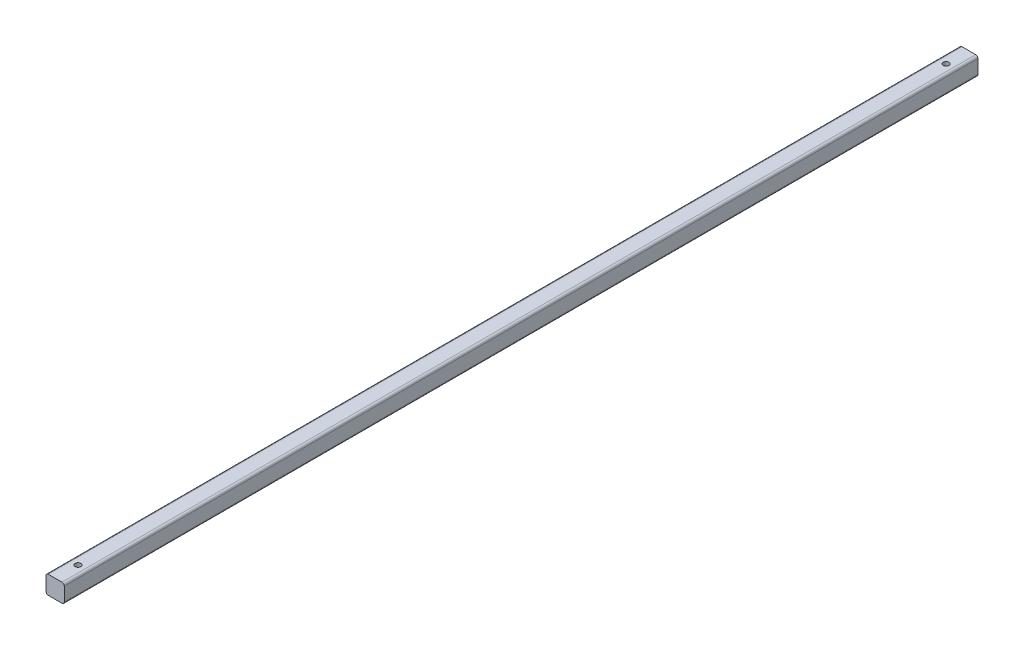
ISO-10303-21;
HEADER;
FILE_DESCRIPTION(('STEP AP214'),'2;1');
FILE_NAME('part.step','',(''),(''),'','','');
FILE_SCHEMA(('AUTOMOTIVE_DESIGN { 1 0 10303 214 1 1 1 1 }'));
ENDSEC;
DATA;
#1=APPLICATION_CONTEXT('core data for automotive mechanical design processes');
#2=APPLICATION_PROTOCOL_DEFINITION('international standard','automotive_design',2000,#1);
#3=PRODUCT_CONTEXT('',#1,'mechanical');
#4=PRODUCT('Part','Part','',(#3));
#5=PRODUCT_RELATED_PRODUCT_CATEGORY('part','',(#4));
#6=PRODUCT_DEFINITION_FORMATION('','',#4);
#7=PRODUCT_DEFINITION_CONTEXT('part definition',#1,'design');
#8=PRODUCT_DEFINITION('design','',#6,#7);
#9=PRODUCT_DEFINITION_SHAPE('','',#8);
#10=(LENGTH_UNIT() NAMED_UNIT(*) SI_UNIT(.MILLI.,.METRE.));
#11=(NAMED_UNIT(*) PLANE_ANGLE_UNIT() SI_UNIT($,.RADIAN.));
#12=(NAMED_UNIT(*) SI_UNIT($,.STERADIAN.) SOLID_ANGLE_UNIT());
#13=UNCERTAINTY_MEASURE_WITH_UNIT(LENGTH_MEASURE(1.E-05),#10,'distance_accuracy_value','');
#14=(GEOMETRIC_REPRESENTATION_CONTEXT(3) GLOBAL_UNCERTAINTY_ASSIGNED_CONTEXT((#13)) GLOBAL_UNIT_ASSIGNED_CONTEXT((#10,
#11,#12)) REPRESENTATION_CONTEXT('',''));
#15=CARTESIAN_POINT('',(0.,0.,0.));
#16=DIRECTION('',(0.,0.,1.));
#17=DIRECTION('',(1.,0.,0.));
#18=AXIS2_PLACEMENT_3D('',#15,#16,#17);
#19=CARTESIAN_POINT('',(-1.99999999999997,-2.,100.));
#20=DIRECTION('',(1.,0.,0.));
#21=DIRECTION('',(0.,0.,-1.));
#22=AXIS2_PLACEMENT_3D('',#19,#20,#21);
#23=PLANE('',#22);
#24=DIRECTION('',(0.,-1.,0.));
#25=VECTOR('',#24,1.);
#26=CARTESIAN_POINT('',(-1.99999999999997,-2.,-100.));
#27=LINE('',#26,#25);
#28=CARTESIAN_POINT('',(-1.99999999999997,1.5,-100.));
#29=VERTEX_POINT('',#28);
#30=CARTESIAN_POINT('',(-1.99999999999997,-1.5,-100.));
#31=VERTEX_POINT('',#30);
#32=EDGE_CURVE('E185',#29,#31,#27,.T.);
#33=ORIENTED_EDGE('',*,*,#32,.T.);
#34=DIRECTION('',(0.,0.,-1.));
#35=VECTOR('',#34,1.);
#36=CARTESIAN_POINT('',(-1.99999999999997,-1.5,100.));
#37=LINE('',#36,#35);
#38=CARTESIAN_POINT('',(-1.99999999999997,-1.5,100.));
#39=VERTEX_POINT('',#38);
#40=EDGE_CURVE('E11',#31,#39,#37,.F.);
#41=ORIENTED_EDGE('',*,*,#40,.T.);
#42=DIRECTION('',(0.,-1.,0.));
#43=VECTOR('',#42,1.);
#44=CARTESIAN_POINT('',(-1.99999999999997,-2.,100.));
#45=LINE('',#44,#43);
#46=CARTESIAN_POINT('',(-1.99999999999997,1.5,100.));
#47=VERTEX_POINT('',#46);
#48=EDGE_CURVE('E138',#47,#39,#45,.T.);
#49=ORIENTED_EDGE('',*,*,#48,.F.);
#50=DIRECTION('',(0.,0.,-1.));
#51=VECTOR('',#50,1.);
#52=CARTESIAN_POINT('',(-1.99999999999997,1.5,100.));
#53=LINE('',#52,#51);
#54=EDGE_CURVE('E51',#47,#29,#53,.T.);
#55=ORIENTED_EDGE('',*,*,#54,.T.);
#56=EDGE_LOOP('',(#33,#41,#49,#55));
#57=FACE_BOUND('',#56,.T.);
#58=ADVANCED_FACE('F42',(#57),#23,.F.);
#59=CARTESIAN_POINT('',(1.99999999999997,-2.,100.));
#60=DIRECTION('',(0.,1.,0.));
#61=DIRECTION('',(0.,0.,1.));
#62=AXIS2_PLACEMENT_3D('',#59,#60,#61);
#63=PLANE('',#62);
#64=CARTESIAN_POINT('',(0.,-2.,-95.));
#65=DIRECTION('',(0.,1.,0.));
#66=DIRECTION('',(0.,0.,1.));
#67=AXIS2_PLACEMENT_3D('',#64,#65,#66);
#68=CIRCLE('',#67,0.624999999999998);
#69=CARTESIAN_POINT('',(0.,-2.,-94.375));
#70=VERTEX_POINT('',#69);
#71=EDGE_CURVE('E210',#70,#70,#68,.T.);
#72=ORIENTED_EDGE('',*,*,#71,.T.);
#73=EDGE_LOOP('',(#72));
#74=FACE_BOUND('',#73,.T.);
#75=CARTESIAN_POINT('',(0.,-2.,95.));
#76=DIRECTION('',(0.,1.,0.));
#77=DIRECTION('',(0.,0.,1.));
#78=AXIS2_PLACEMENT_3D('',#75,#76,#77);
#79=CIRCLE('',#78,0.624999999999998);
#80=CARTESIAN_POINT('',(0.,-2.,95.625));
#81=VERTEX_POINT('',#80);
#82=EDGE_CURVE('E191',#81,#81,#79,.T.);
#83=ORIENTED_EDGE('',*,*,#82,.T.);
#84=EDGE_LOOP('',(#83));
#85=FACE_BOUND('',#84,.T.);
#86=DIRECTION('',(1.,0.,0.));
#87=VECTOR('',#86,1.);
#88=CARTESIAN_POINT('',(1.99999999999997,-2.,-100.));
#89=LINE('',#88,#87);
#90=CARTESIAN_POINT('',(-1.49999999999997,-2.,-100.));
#91=VERTEX_POINT('',#90);
#92=CARTESIAN_POINT('',(1.49999999999997,-2.,-100.));
#93=VERTEX_POINT('',#92);
#94=EDGE_CURVE('E145',#91,#93,#89,.T.);
#95=ORIENTED_EDGE('',*,*,#94,.T.);
#96=DIRECTION('',(0.,0.,-1.));
#97=VECTOR('',#96,1.);
#98=CARTESIAN_POINT('',(1.49999999999997,-2.,100.));
#99=LINE('',#98,#97);
#100=CARTESIAN_POINT('',(1.49999999999997,-2.,100.));
#101=VERTEX_POINT('',#100);
#102=EDGE_CURVE('E58',#93,#101,#99,.F.);
#103=ORIENTED_EDGE('',*,*,#102,.T.);
#104=DIRECTION('',(1.,0.,0.));
#105=VECTOR('',#104,1.);
#106=CARTESIAN_POINT('',(1.99999999999997,-2.,100.));
#107=LINE('',#106,#105);
#108=CARTESIAN_POINT('',(-1.49999999999997,-2.,100.));
#109=VERTEX_POINT('',#108);
#110=EDGE_CURVE('E143',#109,#101,#107,.T.);
#111=ORIENTED_EDGE('',*,*,#110,.F.);
#112=DIRECTION('',(0.,0.,-1.));
#113=VECTOR('',#112,1.);
#114=CARTESIAN_POINT('',(-1.49999999999997,-2.,100.));
#115=LINE('',#114,#113);
#116=EDGE_CURVE('E174',#109,#91,#115,.T.);
#117=ORIENTED_EDGE('',*,*,#116,.T.);
#118=EDGE_LOOP('',(#95,#103,#111,#117));
#119=FACE_BOUND('',#118,.T.);
#120=ADVANCED_FACE('F242',(#74,#85,#119),#63,.F.);
#121=CARTESIAN_POINT('',(1.99999999999997,-2.,100.));
#122=DIRECTION('',(-1.,0.,0.));
#123=DIRECTION('',(0.,0.,1.));
#124=AXIS2_PLACEMENT_3D('',#121,#122,#123);
#125=PLANE('',#124);
#126=DIRECTION('',(0.,1.,0.));
#127=VECTOR('',#126,1.);
#128=CARTESIAN_POINT('',(1.99999999999997,-2.,-100.));
#129=LINE('',#128,#127);
#130=CARTESIAN_POINT('',(1.99999999999997,-1.5,-100.));
#131=VERTEX_POINT('',#130);
#132=CARTESIAN_POINT('',(1.99999999999997,1.5,-100.));
#133=VERTEX_POINT('',#132);
#134=EDGE_CURVE('E139',#131,#133,#129,.T.);
#135=ORIENTED_EDGE('',*,*,#134,.T.);
#136=DIRECTION('',(0.,0.,-1.));
#137=VECTOR('',#136,1.);
#138=CARTESIAN_POINT('',(1.99999999999997,1.5,100.));
#139=LINE('',#138,#137);
#140=CARTESIAN_POINT('',(1.99999999999997,1.5,100.));
#141=VERTEX_POINT('',#140);
#142=EDGE_CURVE('E114',#133,#141,#139,.F.);
#143=ORIENTED_EDGE('',*,*,#142,.T.);
#144=DIRECTION('',(0.,1.,0.));
#145=VECTOR('',#144,1.);
#146=CARTESIAN_POINT('',(1.99999999999997,-2.,100.));
#147=LINE('',#146,#145);
#148=CARTESIAN_POINT('',(1.99999999999997,-1.5,100.));
#149=VERTEX_POINT('',#148);
#150=EDGE_CURVE('E201',#149,#141,#147,.T.);
#151=ORIENTED_EDGE('',*,*,#150,.F.);
#152=DIRECTION('',(0.,0.,-1.));
#153=VECTOR('',#152,1.);
#154=CARTESIAN_POINT('',(1.99999999999997,-1.5,100.));
#155=LINE('',#154,#153);
#156=EDGE_CURVE('E120',#149,#131,#155,.T.);
#157=ORIENTED_EDGE('',*,*,#156,.T.);
#158=EDGE_LOOP('',(#135,#143,#151,#157));
#159=FACE_BOUND('',#158,.T.);
#160=ADVANCED_FACE('F224',(#159),#125,.F.);
#161=CARTESIAN_POINT('',(1.99999999999997,2.,100.));
#162=DIRECTION('',(0.,-1.,0.));
#163=DIRECTION('',(0.,0.,-1.));
#164=AXIS2_PLACEMENT_3D('',#161,#162,#163);
#165=PLANE('',#164);
#166=CARTESIAN_POINT('',(0.,2.,-95.));
#167=DIRECTION('',(0.,1.,0.));
#168=DIRECTION('',(0.,0.,1.));
#169=AXIS2_PLACEMENT_3D('',#166,#167,#168);
#170=CIRCLE('',#169,0.624999999999999);
#171=CARTESIAN_POINT('',(0.,2.,-94.375));
#172=VERTEX_POINT('',#171);
#173=EDGE_CURVE('E214',#172,#172,#170,.T.);
#174=ORIENTED_EDGE('',*,*,#173,.F.);
#175=EDGE_LOOP('',(#174));
#176=FACE_BOUND('',#175,.T.);
#177=CARTESIAN_POINT('',(0.,2.,95.));
#178=DIRECTION('',(0.,1.,0.));
#179=DIRECTION('',(0.,0.,1.));
#180=AXIS2_PLACEMENT_3D('',#177,#178,#179);
#181=CIRCLE('',#180,0.624999999999999);
#182=CARTESIAN_POINT('',(0.,2.,95.625));
#183=VERTEX_POINT('',#182);
#184=EDGE_CURVE('E196',#183,#183,#181,.T.);
#185=ORIENTED_EDGE('',*,*,#184,.F.);
#186=EDGE_LOOP('',(#185));
#187=FACE_BOUND('',#186,.T.);
#188=DIRECTION('',(-1.,0.,0.));
#189=VECTOR('',#188,1.);
#190=CARTESIAN_POINT('',(1.99999999999997,2.,100.));
#191=LINE('',#190,#189);
#192=CARTESIAN_POINT('',(1.49999999999997,2.,100.));
#193=VERTEX_POINT('',#192);
#194=CARTESIAN_POINT('',(-1.49999999999997,2.,100.));
#195=VERTEX_POINT('',#194);
#196=EDGE_CURVE('E130',#193,#195,#191,.T.);
#197=ORIENTED_EDGE('',*,*,#196,.F.);
#198=DIRECTION('',(0.,0.,-1.));
#199=VECTOR('',#198,1.);
#200=CARTESIAN_POINT('',(1.49999999999997,2.,100.));
#201=LINE('',#200,#199);
#202=CARTESIAN_POINT('',(1.49999999999997,2.,-100.));
#203=VERTEX_POINT('',#202);
#204=EDGE_CURVE('E113',#193,#203,#201,.T.);
#205=ORIENTED_EDGE('',*,*,#204,.T.);
#206=DIRECTION('',(-1.,0.,0.));
#207=VECTOR('',#206,1.);
#208=CARTESIAN_POINT('',(1.99999999999997,2.,-100.));
#209=LINE('',#208,#207);
#210=CARTESIAN_POINT('',(-1.49999999999997,2.,-100.));
#211=VERTEX_POINT('',#210);
#212=EDGE_CURVE('E127',#203,#211,#209,.T.);
#213=ORIENTED_EDGE('',*,*,#212,.T.);
#214=DIRECTION('',(0.,0.,-1.));
#215=VECTOR('',#214,1.);
#216=CARTESIAN_POINT('',(-1.49999999999997,2.,100.));
#217=LINE('',#216,#215);
#218=EDGE_CURVE('E133',#211,#195,#217,.F.);
#219=ORIENTED_EDGE('',*,*,#218,.T.);
#220=EDGE_LOOP('',(#197,#205,#213,#219));
#221=FACE_BOUND('',#220,.T.);
#222=ADVANCED_FACE('F126',(#176,#187,#221),#165,.F.);
#223=CARTESIAN_POINT('',(0.,0.,100.));
#224=DIRECTION('',(0.,0.,1.));
#225=DIRECTION('',(1.,0.,0.));
#226=AXIS2_PLACEMENT_3D('',#223,#224,#225);
#227=PLANE('',#226);
#228=ORIENTED_EDGE('',*,*,#150,.T.);
#229=CARTESIAN_POINT('',(1.49999999999997,1.5,100.));
#230=DIRECTION('',(0.,0.,1.));
#231=DIRECTION('',(1.,0.,0.));
#232=AXIS2_PLACEMENT_3D('',#229,#230,#231);
#233=CIRCLE('',#232,0.5);
#234=EDGE_CURVE('E171',#141,#193,#233,.T.);
#235=ORIENTED_EDGE('',*,*,#234,.T.);
#236=ORIENTED_EDGE('',*,*,#196,.T.);
#237=CARTESIAN_POINT('',(-1.49999999999997,1.5,100.));
#238=DIRECTION('',(0.,0.,1.));
#239=DIRECTION('',(1.,0.,0.));
#240=AXIS2_PLACEMENT_3D('',#237,#238,#239);
#241=CIRCLE('',#240,0.5);
#242=EDGE_CURVE('E163',#195,#47,#241,.T.);
#243=ORIENTED_EDGE('',*,*,#242,.T.);
#244=ORIENTED_EDGE('',*,*,#48,.T.);
#245=CARTESIAN_POINT('',(-1.49999999999997,-1.5,100.));
#246=DIRECTION('',(0.,0.,1.));
#247=DIRECTION('',(1.,0.,0.));
#248=AXIS2_PLACEMENT_3D('',#245,#246,#247);
#249=CIRCLE('',#248,0.5);
#250=EDGE_CURVE('E65',#39,#109,#249,.T.);
#251=ORIENTED_EDGE('',*,*,#250,.T.);
#252=ORIENTED_EDGE('',*,*,#110,.T.);
#253=CARTESIAN_POINT('',(1.49999999999997,-1.5,100.));
#254=DIRECTION('',(0.,0.,1.));
#255=DIRECTION('',(1.,0.,0.));
#256=AXIS2_PLACEMENT_3D('',#253,#254,#255);
#257=CIRCLE('',#256,0.5);
#258=EDGE_CURVE('E168',#101,#149,#257,.T.);
#259=ORIENTED_EDGE('',*,*,#258,.T.);
#260=EDGE_LOOP('',(#228,#235,#236,#243,#244,#251,#252,#259));
#261=FACE_BOUND('',#260,.T.);
#262=ADVANCED_FACE('F223',(#261),#227,.T.);
#263=CARTESIAN_POINT('',(0.,0.,-100.));
#264=DIRECTION('',(0.,0.,1.));
#265=DIRECTION('',(1.,0.,0.));
#266=AXIS2_PLACEMENT_3D('',#263,#264,#265);
#267=PLANE('',#266);
#268=ORIENTED_EDGE('',*,*,#212,.F.);
#269=CARTESIAN_POINT('',(1.49999999999997,1.5,-100.));
#270=DIRECTION('',(0.,0.,1.));
#271=DIRECTION('',(1.,0.,0.));
#272=AXIS2_PLACEMENT_3D('',#269,#270,#271);
#273=CIRCLE('',#272,0.5);
#274=EDGE_CURVE('E109',#203,#133,#273,.F.);
#275=ORIENTED_EDGE('',*,*,#274,.T.);
#276=ORIENTED_EDGE('',*,*,#134,.F.);
#277=CARTESIAN_POINT('',(1.49999999999997,-1.5,-100.));
#278=DIRECTION('',(0.,0.,1.));
#279=DIRECTION('',(1.,0.,0.));
#280=AXIS2_PLACEMENT_3D('',#277,#278,#279);
#281=CIRCLE('',#280,0.5);
#282=EDGE_CURVE('E121',#131,#93,#281,.F.);
#283=ORIENTED_EDGE('',*,*,#282,.T.);
#284=ORIENTED_EDGE('',*,*,#94,.F.);
#285=CARTESIAN_POINT('',(-1.49999999999997,-1.5,-100.));
#286=DIRECTION('',(0.,0.,1.));
#287=DIRECTION('',(1.,0.,0.));
#288=AXIS2_PLACEMENT_3D('',#285,#286,#287);
#289=CIRCLE('',#288,0.5);
#290=EDGE_CURVE('E153',#91,#31,#289,.F.);
#291=ORIENTED_EDGE('',*,*,#290,.T.);
#292=ORIENTED_EDGE('',*,*,#32,.F.);
#293=CARTESIAN_POINT('',(-1.49999999999997,1.5,-100.));
#294=DIRECTION('',(0.,0.,1.));
#295=DIRECTION('',(1.,0.,0.));
#296=AXIS2_PLACEMENT_3D('',#293,#294,#295);
#297=CIRCLE('',#296,0.5);
#298=EDGE_CURVE('E132',#29,#211,#297,.F.);
#299=ORIENTED_EDGE('',*,*,#298,.T.);
#300=EDGE_LOOP('',(#268,#275,#276,#283,#284,#291,#292,#299));
#301=FACE_BOUND('',#300,.T.);
#302=ADVANCED_FACE('F135',(#301),#267,.F.);
#303=CARTESIAN_POINT('',(1.49999999999997,1.5,100.));
#304=DIRECTION('',(0.,0.,-1.));
#305=DIRECTION('',(-1.,0.,0.));
#306=AXIS2_PLACEMENT_3D('',#303,#304,#305);
#307=CYLINDRICAL_SURFACE('',#306,0.5);
#308=ORIENTED_EDGE('',*,*,#234,.F.);
#309=ORIENTED_EDGE('',*,*,#142,.F.);
#310=ORIENTED_EDGE('',*,*,#274,.F.);
#311=ORIENTED_EDGE('',*,*,#204,.F.);
#312=EDGE_LOOP('',(#308,#309,#310,#311));
#313=FACE_BOUND('',#312,.T.);
#314=ADVANCED_FACE('F112',(#313),#307,.T.);
#315=CARTESIAN_POINT('',(1.49999999999997,-1.5,100.));
#316=DIRECTION('',(0.,0.,-1.));
#317=DIRECTION('',(-1.,0.,0.));
#318=AXIS2_PLACEMENT_3D('',#315,#316,#317);
#319=CYLINDRICAL_SURFACE('',#318,0.5);
#320=ORIENTED_EDGE('',*,*,#258,.F.);
#321=ORIENTED_EDGE('',*,*,#102,.F.);
#322=ORIENTED_EDGE('',*,*,#282,.F.);
#323=ORIENTED_EDGE('',*,*,#156,.F.);
#324=EDGE_LOOP('',(#320,#321,#322,#323));
#325=FACE_BOUND('',#324,.T.);
#326=ADVANCED_FACE('F253',(#325),#319,.T.);
#327=CARTESIAN_POINT('',(-1.49999999999997,-1.5,100.));
#328=DIRECTION('',(0.,0.,-1.));
#329=DIRECTION('',(-1.,0.,0.));
#330=AXIS2_PLACEMENT_3D('',#327,#328,#329);
#331=CYLINDRICAL_SURFACE('',#330,0.5);
#332=ORIENTED_EDGE('',*,*,#250,.F.);
#333=ORIENTED_EDGE('',*,*,#40,.F.);
#334=ORIENTED_EDGE('',*,*,#290,.F.);
#335=ORIENTED_EDGE('',*,*,#116,.F.);
#336=EDGE_LOOP('',(#332,#333,#334,#335));
#337=FACE_BOUND('',#336,.T.);
#338=ADVANCED_FACE('F238',(#337),#331,.T.);
#339=CARTESIAN_POINT('',(-1.49999999999997,1.5,100.));
#340=DIRECTION('',(0.,0.,-1.));
#341=DIRECTION('',(-1.,0.,0.));
#342=AXIS2_PLACEMENT_3D('',#339,#340,#341);
#343=CYLINDRICAL_SURFACE('',#342,0.5);
#344=ORIENTED_EDGE('',*,*,#242,.F.);
#345=ORIENTED_EDGE('',*,*,#218,.F.);
#346=ORIENTED_EDGE('',*,*,#298,.F.);
#347=ORIENTED_EDGE('',*,*,#54,.F.);
#348=EDGE_LOOP('',(#344,#345,#346,#347));
#349=FACE_BOUND('',#348,.T.);
#350=ADVANCED_FACE('F44',(#349),#343,.T.);
#351=CARTESIAN_POINT('',(0.,2.,95.));
#352=DIRECTION('',(0.,1.,0.));
#353=DIRECTION('',(0.,0.,1.));
#354=AXIS2_PLACEMENT_3D('',#351,#352,#353);
#355=CYLINDRICAL_SURFACE('',#354,0.624999999999999);
#356=ORIENTED_EDGE('',*,*,#82,.F.);
#357=EDGE_LOOP('',(#356));
#358=FACE_BOUND('',#357,.T.);
#359=ORIENTED_EDGE('',*,*,#184,.T.);
#360=EDGE_LOOP('',(#359));
#361=FACE_BOUND('',#360,.T.);
#362=ADVANCED_FACE('F228',(#358,#361),#355,.F.);
#363=CARTESIAN_POINT('',(0.,2.,-95.));
#364=DIRECTION('',(0.,1.,0.));
#365=DIRECTION('',(0.,0.,1.));
#366=AXIS2_PLACEMENT_3D('',#363,#364,#365);
#367=CYLINDRICAL_SURFACE('',#366,0.624999999999999);
#368=ORIENTED_EDGE('',*,*,#71,.F.);
#369=EDGE_LOOP('',(#368));
#370=FACE_BOUND('',#369,.T.);
#371=ORIENTED_EDGE('',*,*,#173,.T.);
#372=EDGE_LOOP('',(#371));
#373=FACE_BOUND('',#372,.T.);
#374=ADVANCED_FACE('F219',(#370,#373),#367,.F.);
#375=CLOSED_SHELL('',(#58,#120,#160,#222,#262,#302,#314,#326,#338,#350,#362,#374));
#376=MANIFOLD_SOLID_BREP('B2',#375);
#377=ADVANCED_BREP_SHAPE_REPRESENTATION('',(#18,#376),#14);
#378=SHAPE_DEFINITION_REPRESENTATION(#9,#377);
ENDSEC;
END-ISO-10303-21;
